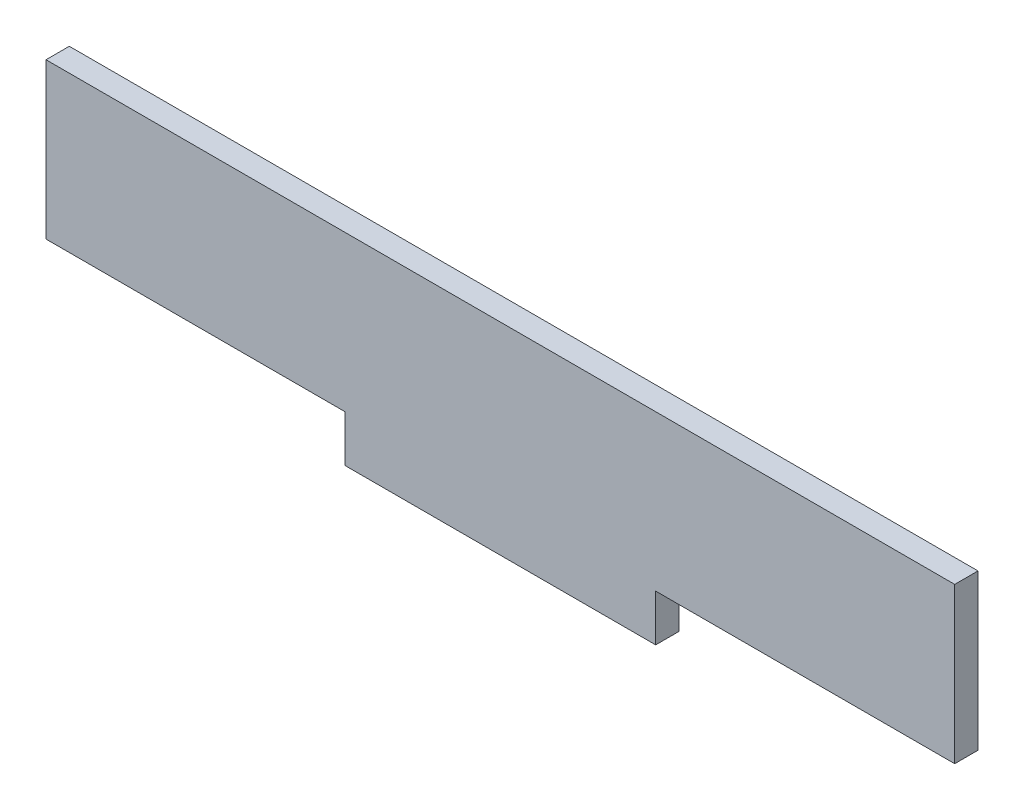
ISO-10303-21;
HEADER;
FILE_DESCRIPTION(('STEP AP214'),'2;1');
FILE_NAME('part.step','',(''),(''),'','','');
FILE_SCHEMA(('AUTOMOTIVE_DESIGN { 1 0 10303 214 1 1 1 1 }'));
ENDSEC;
DATA;
#1=APPLICATION_CONTEXT('core data for automotive mechanical design processes');
#2=APPLICATION_PROTOCOL_DEFINITION('international standard','automotive_design',2000,#1);
#3=PRODUCT_CONTEXT('',#1,'mechanical');
#4=PRODUCT('Part','Part','',(#3));
#5=PRODUCT_RELATED_PRODUCT_CATEGORY('part','',(#4));
#6=PRODUCT_DEFINITION_FORMATION('','',#4);
#7=PRODUCT_DEFINITION_CONTEXT('part definition',#1,'design');
#8=PRODUCT_DEFINITION('design','',#6,#7);
#9=PRODUCT_DEFINITION_SHAPE('','',#8);
#10=(LENGTH_UNIT() NAMED_UNIT(*) SI_UNIT(.MILLI.,.METRE.));
#11=(NAMED_UNIT(*) PLANE_ANGLE_UNIT() SI_UNIT($,.RADIAN.));
#12=(NAMED_UNIT(*) SI_UNIT($,.STERADIAN.) SOLID_ANGLE_UNIT());
#13=UNCERTAINTY_MEASURE_WITH_UNIT(LENGTH_MEASURE(1.E-05),#10,'distance_accuracy_value','');
#14=(GEOMETRIC_REPRESENTATION_CONTEXT(3) GLOBAL_UNCERTAINTY_ASSIGNED_CONTEXT((#13)) GLOBAL_UNIT_ASSIGNED_CONTEXT((#10,
#11,#12)) REPRESENTATION_CONTEXT('',''));
#15=CARTESIAN_POINT('',(0.,0.,0.));
#16=DIRECTION('',(0.,0.,1.));
#17=DIRECTION('',(1.,0.,0.));
#18=AXIS2_PLACEMENT_3D('',#15,#16,#17);
#19=CARTESIAN_POINT('',(0.,20.,3.));
#20=DIRECTION('',(1.,0.,0.));
#21=DIRECTION('',(0.,0.,-1.));
#22=AXIS2_PLACEMENT_3D('',#19,#20,#21);
#23=PLANE('',#22);
#24=DIRECTION('',(0.,-1.,0.));
#25=VECTOR('',#24,1.);
#26=CARTESIAN_POINT('',(0.,20.,0.));
#27=LINE('',#26,#25);
#28=CARTESIAN_POINT('',(0.,20.,0.));
#29=VERTEX_POINT('',#28);
#30=CARTESIAN_POINT('',(0.,0.,0.));
#31=VERTEX_POINT('',#30);
#32=EDGE_CURVE('E139',#29,#31,#27,.T.);
#33=ORIENTED_EDGE('',*,*,#32,.T.);
#34=DIRECTION('',(0.,0.,-1.));
#35=VECTOR('',#34,1.);
#36=CARTESIAN_POINT('',(0.,0.,3.));
#37=LINE('',#36,#35);
#38=CARTESIAN_POINT('',(0.,0.,3.));
#39=VERTEX_POINT('',#38);
#40=EDGE_CURVE('E11',#39,#31,#37,.T.);
#41=ORIENTED_EDGE('',*,*,#40,.F.);
#42=DIRECTION('',(0.,-1.,0.));
#43=VECTOR('',#42,1.);
#44=CARTESIAN_POINT('',(0.,20.,3.));
#45=LINE('',#44,#43);
#46=CARTESIAN_POINT('',(0.,20.,3.));
#47=VERTEX_POINT('',#46);
#48=EDGE_CURVE('E161',#47,#39,#45,.T.);
#49=ORIENTED_EDGE('',*,*,#48,.F.);
#50=DIRECTION('',(0.,0.,-1.));
#51=VECTOR('',#50,1.);
#52=CARTESIAN_POINT('',(0.,20.,3.));
#53=LINE('',#52,#51);
#54=EDGE_CURVE('E135',#47,#29,#53,.T.);
#55=ORIENTED_EDGE('',*,*,#54,.T.);
#56=EDGE_LOOP('',(#33,#41,#49,#55));
#57=FACE_BOUND('',#56,.T.);
#58=ADVANCED_FACE('F38',(#57),#23,.F.);
#59=CARTESIAN_POINT('',(0.,0.,3.));
#60=DIRECTION('',(0.,1.,0.));
#61=DIRECTION('',(0.,0.,1.));
#62=AXIS2_PLACEMENT_3D('',#59,#60,#61);
#63=PLANE('',#62);
#64=DIRECTION('',(1.,0.,0.));
#65=VECTOR('',#64,1.);
#66=CARTESIAN_POINT('',(0.,0.,0.));
#67=LINE('',#66,#65);
#68=CARTESIAN_POINT('',(38.5,0.,0.));
#69=VERTEX_POINT('',#68);
#70=EDGE_CURVE('E143',#31,#69,#67,.T.);
#71=ORIENTED_EDGE('',*,*,#70,.T.);
#72=DIRECTION('',(0.,0.,-1.));
#73=VECTOR('',#72,1.);
#74=CARTESIAN_POINT('',(38.5,0.,3.));
#75=LINE('',#74,#73);
#76=CARTESIAN_POINT('',(38.5,0.,3.));
#77=VERTEX_POINT('',#76);
#78=EDGE_CURVE('E47',#77,#69,#75,.T.);
#79=ORIENTED_EDGE('',*,*,#78,.F.);
#80=DIRECTION('',(1.,0.,0.));
#81=VECTOR('',#80,1.);
#82=CARTESIAN_POINT('',(0.,0.,3.));
#83=LINE('',#82,#81);
#84=EDGE_CURVE('E98',#39,#77,#83,.T.);
#85=ORIENTED_EDGE('',*,*,#84,.F.);
#86=ORIENTED_EDGE('',*,*,#40,.T.);
#87=EDGE_LOOP('',(#71,#79,#85,#86));
#88=FACE_BOUND('',#87,.T.);
#89=ADVANCED_FACE('F207',(#88),#63,.F.);
#90=CARTESIAN_POINT('',(38.5,0.,3.));
#91=DIRECTION('',(1.,0.,0.));
#92=DIRECTION('',(0.,0.,-1.));
#93=AXIS2_PLACEMENT_3D('',#90,#91,#92);
#94=PLANE('',#93);
#95=DIRECTION('',(0.,-1.,0.));
#96=VECTOR('',#95,1.);
#97=CARTESIAN_POINT('',(38.5,0.,0.));
#98=LINE('',#97,#96);
#99=CARTESIAN_POINT('',(38.5,-6.,0.));
#100=VERTEX_POINT('',#99);
#101=EDGE_CURVE('E146',#69,#100,#98,.T.);
#102=ORIENTED_EDGE('',*,*,#101,.T.);
#103=DIRECTION('',(0.,0.,-1.));
#104=VECTOR('',#103,1.);
#105=CARTESIAN_POINT('',(38.5,-6.,3.));
#106=LINE('',#105,#104);
#107=CARTESIAN_POINT('',(38.5,-6.,3.));
#108=VERTEX_POINT('',#107);
#109=EDGE_CURVE('E172',#108,#100,#106,.T.);
#110=ORIENTED_EDGE('',*,*,#109,.F.);
#111=DIRECTION('',(0.,-1.,0.));
#112=VECTOR('',#111,1.);
#113=CARTESIAN_POINT('',(38.5,0.,3.));
#114=LINE('',#113,#112);
#115=EDGE_CURVE('E182',#77,#108,#114,.T.);
#116=ORIENTED_EDGE('',*,*,#115,.F.);
#117=ORIENTED_EDGE('',*,*,#78,.T.);
#118=EDGE_LOOP('',(#102,#110,#116,#117));
#119=FACE_BOUND('',#118,.T.);
#120=ADVANCED_FACE('F180',(#119),#94,.F.);
#121=CARTESIAN_POINT('',(38.5,-6.,3.));
#122=DIRECTION('',(0.,1.,0.));
#123=DIRECTION('',(0.,0.,1.));
#124=AXIS2_PLACEMENT_3D('',#121,#122,#123);
#125=PLANE('',#124);
#126=DIRECTION('',(1.,0.,0.));
#127=VECTOR('',#126,1.);
#128=CARTESIAN_POINT('',(38.5,-6.,0.));
#129=LINE('',#128,#127);
#130=CARTESIAN_POINT('',(78.5,-6.,0.));
#131=VERTEX_POINT('',#130);
#132=EDGE_CURVE('E149',#100,#131,#129,.T.);
#133=ORIENTED_EDGE('',*,*,#132,.T.);
#134=DIRECTION('',(0.,0.,-1.));
#135=VECTOR('',#134,1.);
#136=CARTESIAN_POINT('',(78.5,-6.,3.));
#137=LINE('',#136,#135);
#138=CARTESIAN_POINT('',(78.5,-6.,3.));
#139=VERTEX_POINT('',#138);
#140=EDGE_CURVE('E168',#139,#131,#137,.T.);
#141=ORIENTED_EDGE('',*,*,#140,.F.);
#142=DIRECTION('',(1.,0.,0.));
#143=VECTOR('',#142,1.);
#144=CARTESIAN_POINT('',(38.5,-6.,3.));
#145=LINE('',#144,#143);
#146=EDGE_CURVE('E195',#108,#139,#145,.T.);
#147=ORIENTED_EDGE('',*,*,#146,.F.);
#148=ORIENTED_EDGE('',*,*,#109,.T.);
#149=EDGE_LOOP('',(#133,#141,#147,#148));
#150=FACE_BOUND('',#149,.T.);
#151=ADVANCED_FACE('F190',(#150),#125,.F.);
#152=CARTESIAN_POINT('',(78.5,-6.,3.));
#153=DIRECTION('',(-1.,0.,0.));
#154=DIRECTION('',(0.,0.,1.));
#155=AXIS2_PLACEMENT_3D('',#152,#153,#154);
#156=PLANE('',#155);
#157=DIRECTION('',(0.,1.,0.));
#158=VECTOR('',#157,1.);
#159=CARTESIAN_POINT('',(78.5,-6.,0.));
#160=LINE('',#159,#158);
#161=CARTESIAN_POINT('',(78.5,0.,0.));
#162=VERTEX_POINT('',#161);
#163=EDGE_CURVE('E152',#131,#162,#160,.T.);
#164=ORIENTED_EDGE('',*,*,#163,.T.);
#165=DIRECTION('',(0.,0.,-1.));
#166=VECTOR('',#165,1.);
#167=CARTESIAN_POINT('',(78.5,0.,3.));
#168=LINE('',#167,#166);
#169=CARTESIAN_POINT('',(78.5,0.,3.));
#170=VERTEX_POINT('',#169);
#171=EDGE_CURVE('E128',#170,#162,#168,.T.);
#172=ORIENTED_EDGE('',*,*,#171,.F.);
#173=DIRECTION('',(0.,1.,0.));
#174=VECTOR('',#173,1.);
#175=CARTESIAN_POINT('',(78.5,-6.,3.));
#176=LINE('',#175,#174);
#177=EDGE_CURVE('E117',#139,#170,#176,.T.);
#178=ORIENTED_EDGE('',*,*,#177,.F.);
#179=ORIENTED_EDGE('',*,*,#140,.T.);
#180=EDGE_LOOP('',(#164,#172,#178,#179));
#181=FACE_BOUND('',#180,.T.);
#182=ADVANCED_FACE('F193',(#181),#156,.F.);
#183=CARTESIAN_POINT('',(78.5,0.,3.));
#184=DIRECTION('',(0.,1.,0.));
#185=DIRECTION('',(0.,0.,1.));
#186=AXIS2_PLACEMENT_3D('',#183,#184,#185);
#187=PLANE('',#186);
#188=DIRECTION('',(1.,0.,0.));
#189=VECTOR('',#188,1.);
#190=CARTESIAN_POINT('',(78.5,0.,0.));
#191=LINE('',#190,#189);
#192=CARTESIAN_POINT('',(117.,0.,0.));
#193=VERTEX_POINT('',#192);
#194=EDGE_CURVE('E126',#162,#193,#191,.T.);
#195=ORIENTED_EDGE('',*,*,#194,.T.);
#196=DIRECTION('',(0.,0.,-1.));
#197=VECTOR('',#196,1.);
#198=CARTESIAN_POINT('',(117.,0.,3.));
#199=LINE('',#198,#197);
#200=CARTESIAN_POINT('',(117.,0.,3.));
#201=VERTEX_POINT('',#200);
#202=EDGE_CURVE('E123',#201,#193,#199,.T.);
#203=ORIENTED_EDGE('',*,*,#202,.F.);
#204=DIRECTION('',(1.,0.,0.));
#205=VECTOR('',#204,1.);
#206=CARTESIAN_POINT('',(78.5,0.,3.));
#207=LINE('',#206,#205);
#208=EDGE_CURVE('E111',#170,#201,#207,.T.);
#209=ORIENTED_EDGE('',*,*,#208,.F.);
#210=ORIENTED_EDGE('',*,*,#171,.T.);
#211=EDGE_LOOP('',(#195,#203,#209,#210));
#212=FACE_BOUND('',#211,.T.);
#213=ADVANCED_FACE('F124',(#212),#187,.F.);
#214=CARTESIAN_POINT('',(117.,0.,3.));
#215=DIRECTION('',(-1.,0.,0.));
#216=DIRECTION('',(0.,0.,1.));
#217=AXIS2_PLACEMENT_3D('',#214,#215,#216);
#218=PLANE('',#217);
#219=DIRECTION('',(0.,1.,0.));
#220=VECTOR('',#219,1.);
#221=CARTESIAN_POINT('',(117.,0.,0.));
#222=LINE('',#221,#220);
#223=CARTESIAN_POINT('',(117.,20.,0.));
#224=VERTEX_POINT('',#223);
#225=EDGE_CURVE('E84',#193,#224,#222,.T.);
#226=ORIENTED_EDGE('',*,*,#225,.T.);
#227=DIRECTION('',(0.,0.,-1.));
#228=VECTOR('',#227,1.);
#229=CARTESIAN_POINT('',(117.,20.,3.));
#230=LINE('',#229,#228);
#231=CARTESIAN_POINT('',(117.,20.,3.));
#232=VERTEX_POINT('',#231);
#233=EDGE_CURVE('E129',#232,#224,#230,.T.);
#234=ORIENTED_EDGE('',*,*,#233,.F.);
#235=DIRECTION('',(0.,1.,0.));
#236=VECTOR('',#235,1.);
#237=CARTESIAN_POINT('',(117.,0.,3.));
#238=LINE('',#237,#236);
#239=EDGE_CURVE('E115',#201,#232,#238,.T.);
#240=ORIENTED_EDGE('',*,*,#239,.F.);
#241=ORIENTED_EDGE('',*,*,#202,.T.);
#242=EDGE_LOOP('',(#226,#234,#240,#241));
#243=FACE_BOUND('',#242,.T.);
#244=ADVANCED_FACE('F131',(#243),#218,.F.);
#245=CARTESIAN_POINT('',(117.,20.,3.));
#246=DIRECTION('',(0.,-1.,0.));
#247=DIRECTION('',(0.,0.,-1.));
#248=AXIS2_PLACEMENT_3D('',#245,#246,#247);
#249=PLANE('',#248);
#250=DIRECTION('',(-1.,0.,0.));
#251=VECTOR('',#250,1.);
#252=CARTESIAN_POINT('',(117.,20.,0.));
#253=LINE('',#252,#251);
#254=EDGE_CURVE('E90',#224,#29,#253,.T.);
#255=ORIENTED_EDGE('',*,*,#254,.T.);
#256=ORIENTED_EDGE('',*,*,#54,.F.);
#257=DIRECTION('',(-1.,0.,0.));
#258=VECTOR('',#257,1.);
#259=CARTESIAN_POINT('',(117.,20.,3.));
#260=LINE('',#259,#258);
#261=EDGE_CURVE('E55',#232,#47,#260,.T.);
#262=ORIENTED_EDGE('',*,*,#261,.F.);
#263=ORIENTED_EDGE('',*,*,#233,.T.);
#264=EDGE_LOOP('',(#255,#256,#262,#263));
#265=FACE_BOUND('',#264,.T.);
#266=ADVANCED_FACE('F223',(#265),#249,.F.);
#267=CARTESIAN_POINT('',(0.,0.,3.));
#268=DIRECTION('',(0.,0.,1.));
#269=DIRECTION('',(1.,0.,0.));
#270=AXIS2_PLACEMENT_3D('',#267,#268,#269);
#271=PLANE('',#270);
#272=ORIENTED_EDGE('',*,*,#48,.T.);
#273=ORIENTED_EDGE('',*,*,#84,.T.);
#274=ORIENTED_EDGE('',*,*,#115,.T.);
#275=ORIENTED_EDGE('',*,*,#146,.T.);
#276=ORIENTED_EDGE('',*,*,#177,.T.);
#277=ORIENTED_EDGE('',*,*,#208,.T.);
#278=ORIENTED_EDGE('',*,*,#239,.T.);
#279=ORIENTED_EDGE('',*,*,#261,.T.);
#280=EDGE_LOOP('',(#272,#273,#274,#275,#276,#277,#278,#279));
#281=FACE_BOUND('',#280,.T.);
#282=ADVANCED_FACE('F113',(#281),#271,.T.);
#283=CARTESIAN_POINT('',(0.,0.,0.));
#284=DIRECTION('',(0.,0.,1.));
#285=DIRECTION('',(1.,0.,0.));
#286=AXIS2_PLACEMENT_3D('',#283,#284,#285);
#287=PLANE('',#286);
#288=ORIENTED_EDGE('',*,*,#32,.F.);
#289=ORIENTED_EDGE('',*,*,#254,.F.);
#290=ORIENTED_EDGE('',*,*,#225,.F.);
#291=ORIENTED_EDGE('',*,*,#194,.F.);
#292=ORIENTED_EDGE('',*,*,#163,.F.);
#293=ORIENTED_EDGE('',*,*,#132,.F.);
#294=ORIENTED_EDGE('',*,*,#101,.F.);
#295=ORIENTED_EDGE('',*,*,#70,.F.);
#296=EDGE_LOOP('',(#288,#289,#290,#291,#292,#293,#294,#295));
#297=FACE_BOUND('',#296,.T.);
#298=ADVANCED_FACE('F186',(#297),#287,.F.);
#299=CLOSED_SHELL('',(#58,#89,#120,#151,#182,#213,#244,#266,#282,#298));
#300=MANIFOLD_SOLID_BREP('B2',#299);
#301=ADVANCED_BREP_SHAPE_REPRESENTATION('',(#18,#300),#14);
#302=SHAPE_DEFINITION_REPRESENTATION(#9,#301);
ENDSEC;
END-ISO-10303-21;
